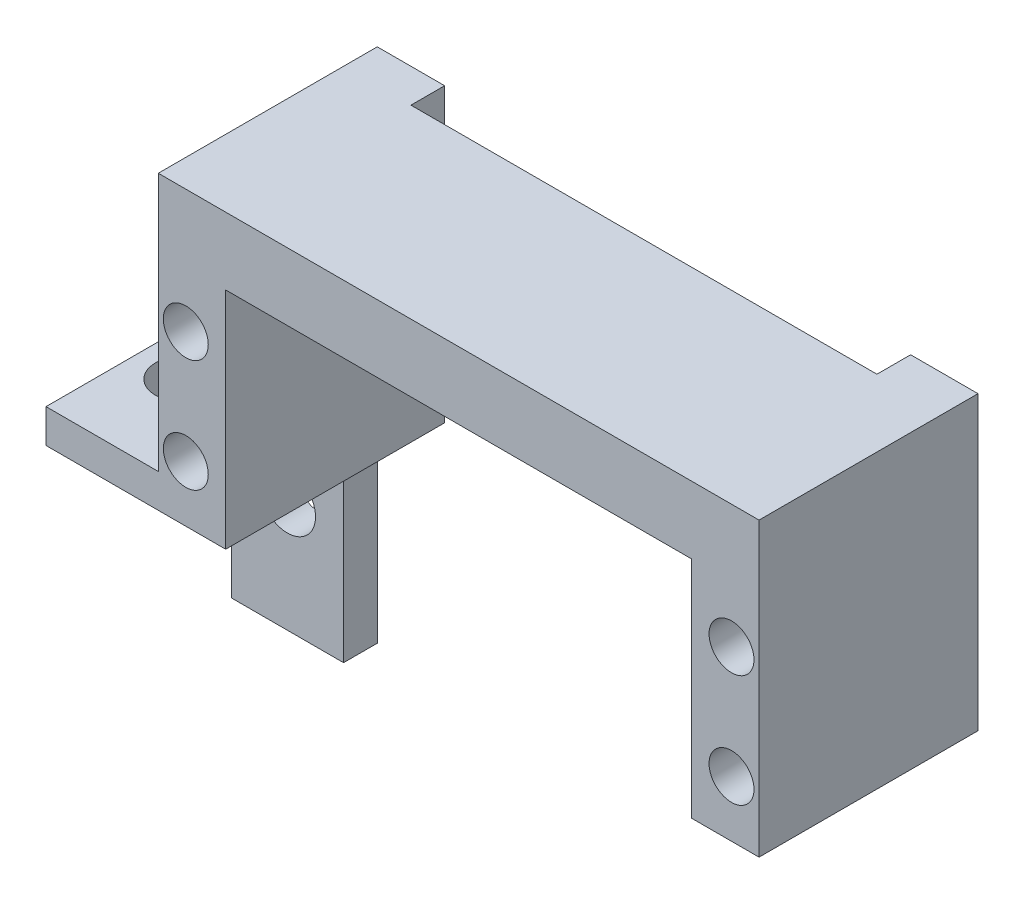
ISO-10303-21;
HEADER;
FILE_DESCRIPTION(('STEP AP214'),'2;1');
FILE_NAME('part.step','',(''),(''),'','','');
FILE_SCHEMA(('AUTOMOTIVE_DESIGN { 1 0 10303 214 1 1 1 1 }'));
ENDSEC;
DATA;
#1=APPLICATION_CONTEXT('core data for automotive mechanical design processes');
#2=APPLICATION_PROTOCOL_DEFINITION('international standard','automotive_design',2000,#1);
#3=PRODUCT_CONTEXT('',#1,'mechanical');
#4=PRODUCT('Part','Part','',(#3));
#5=PRODUCT_RELATED_PRODUCT_CATEGORY('part','',(#4));
#6=PRODUCT_DEFINITION_FORMATION('','',#4);
#7=PRODUCT_DEFINITION_CONTEXT('part definition',#1,'design');
#8=PRODUCT_DEFINITION('design','',#6,#7);
#9=PRODUCT_DEFINITION_SHAPE('','',#8);
#10=(LENGTH_UNIT() NAMED_UNIT(*) SI_UNIT(.MILLI.,.METRE.));
#11=(NAMED_UNIT(*) PLANE_ANGLE_UNIT() SI_UNIT($,.RADIAN.));
#12=(NAMED_UNIT(*) SI_UNIT($,.STERADIAN.) SOLID_ANGLE_UNIT());
#13=UNCERTAINTY_MEASURE_WITH_UNIT(LENGTH_MEASURE(1.E-05),#10,'distance_accuracy_value','');
#14=(GEOMETRIC_REPRESENTATION_CONTEXT(3) GLOBAL_UNCERTAINTY_ASSIGNED_CONTEXT((#13)) GLOBAL_UNIT_ASSIGNED_CONTEXT((#10,
#11,#12)) REPRESENTATION_CONTEXT('',''));
#15=CARTESIAN_POINT('',(0.,0.,0.));
#16=DIRECTION('',(0.,0.,1.));
#17=DIRECTION('',(1.,0.,0.));
#18=AXIS2_PLACEMENT_3D('',#15,#16,#17);
#19=CARTESIAN_POINT('',(20.75,-26.,16.5));
#20=DIRECTION('',(0.,1.,0.));
#21=DIRECTION('',(0.,0.,1.));
#22=AXIS2_PLACEMENT_3D('',#19,#20,#21);
#23=PLANE('',#22);
#24=DIRECTION('',(1.,0.,0.));
#25=VECTOR('',#24,1.);
#26=CARTESIAN_POINT('',(20.75,-26.,16.5));
#27=LINE('',#26,#25);
#28=CARTESIAN_POINT('',(36.75,-26.,16.5));
#29=VERTEX_POINT('',#28);
#30=CARTESIAN_POINT('',(52.75,-26.,16.5));
#31=VERTEX_POINT('',#30);
#32=EDGE_CURVE('E11',#29,#31,#27,.T.);
#33=ORIENTED_EDGE('',*,*,#32,.F.);
#34=DIRECTION('',(0.,0.,-1.));
#35=VECTOR('',#34,1.);
#36=CARTESIAN_POINT('',(36.75,-26.,16.5));
#37=LINE('',#36,#35);
#38=CARTESIAN_POINT('',(36.75,-26.,0.));
#39=VERTEX_POINT('',#38);
#40=EDGE_CURVE('E268',#29,#39,#37,.T.);
#41=ORIENTED_EDGE('',*,*,#40,.T.);
#42=DIRECTION('',(1.,0.,0.));
#43=VECTOR('',#42,1.);
#44=CARTESIAN_POINT('',(20.75,-26.,0.));
#45=LINE('',#44,#43);
#46=CARTESIAN_POINT('',(46.75,-26.,0.));
#47=VERTEX_POINT('',#46);
#48=EDGE_CURVE('E38',#39,#47,#45,.T.);
#49=ORIENTED_EDGE('',*,*,#48,.T.);
#50=DIRECTION('',(0.,0.,1.));
#51=VECTOR('',#50,1.);
#52=CARTESIAN_POINT('',(46.75,-26.,-3.));
#53=LINE('',#52,#51);
#54=CARTESIAN_POINT('',(46.75,-26.,-3.));
#55=VERTEX_POINT('',#54);
#56=EDGE_CURVE('E267',#55,#47,#53,.T.);
#57=ORIENTED_EDGE('',*,*,#56,.F.);
#58=DIRECTION('',(1.,0.,0.));
#59=VECTOR('',#58,1.);
#60=CARTESIAN_POINT('',(52.75,-26.,-3.));
#61=LINE('',#60,#59);
#62=CARTESIAN_POINT('',(52.75,-26.,-3.));
#63=VERTEX_POINT('',#62);
#64=EDGE_CURVE('E279',#55,#63,#61,.T.);
#65=ORIENTED_EDGE('',*,*,#64,.T.);
#66=DIRECTION('',(0.,0.,-1.));
#67=VECTOR('',#66,1.);
#68=CARTESIAN_POINT('',(52.75,-26.,16.5));
#69=LINE('',#68,#67);
#70=EDGE_CURVE('E228',#31,#63,#69,.T.);
#71=ORIENTED_EDGE('',*,*,#70,.F.);
#72=EDGE_LOOP('',(#33,#41,#49,#57,#65,#71));
#73=FACE_BOUND('',#72,.T.);
#74=CARTESIAN_POINT('',(40.75,-26.,8.25));
#75=DIRECTION('',(0.,-1.,0.));
#76=DIRECTION('',(0.,0.,1.));
#77=AXIS2_PLACEMENT_3D('',#74,#75,#76);
#78=CIRCLE('',#77,2.5);
#79=CARTESIAN_POINT('',(40.75,-26.,10.75));
#80=VERTEX_POINT('',#79);
#81=EDGE_CURVE('E205',#80,#80,#78,.T.);
#82=ORIENTED_EDGE('',*,*,#81,.F.);
#83=EDGE_LOOP('',(#82));
#84=FACE_BOUND('',#83,.T.);
#85=ADVANCED_FACE('F35',(#73,#84),#23,.F.);
#86=CARTESIAN_POINT('',(0.,0.,16.5));
#87=DIRECTION('',(0.,0.,1.));
#88=DIRECTION('',(1.,0.,0.));
#89=AXIS2_PLACEMENT_3D('',#86,#87,#88);
#90=PLANE('',#89);
#91=DIRECTION('',(0.,-1.,0.));
#92=VECTOR('',#91,1.);
#93=CARTESIAN_POINT('',(36.75,-46.,16.5));
#94=LINE('',#93,#92);
#95=CARTESIAN_POINT('',(36.75,-23.,16.5));
#96=VERTEX_POINT('',#95);
#97=EDGE_CURVE('E569',#96,#29,#94,.T.);
#98=ORIENTED_EDGE('',*,*,#97,.T.);
#99=ORIENTED_EDGE('',*,*,#32,.T.);
#100=DIRECTION('',(0.,-1.,0.));
#101=VECTOR('',#100,1.);
#102=CARTESIAN_POINT('',(52.75,-6.,16.5));
#103=LINE('',#102,#101);
#104=CARTESIAN_POINT('',(52.75,-6.,16.5));
#105=VERTEX_POINT('',#104);
#106=EDGE_CURVE('E225',#105,#31,#103,.T.);
#107=ORIENTED_EDGE('',*,*,#106,.F.);
#108=DIRECTION('',(-1.,0.,0.));
#109=VECTOR('',#108,1.);
#110=CARTESIAN_POINT('',(73.5,-6.,16.5));
#111=LINE('',#110,#109);
#112=CARTESIAN_POINT('',(94.25,-6.,16.5));
#113=VERTEX_POINT('',#112);
#114=EDGE_CURVE('E222',#113,#105,#111,.T.);
#115=ORIENTED_EDGE('',*,*,#114,.F.);
#116=DIRECTION('',(0.,1.,0.));
#117=VECTOR('',#116,1.);
#118=CARTESIAN_POINT('',(94.25,-6.,16.5));
#119=LINE('',#118,#117);
#120=CARTESIAN_POINT('',(94.25,-26.,16.5));
#121=VERTEX_POINT('',#120);
#122=EDGE_CURVE('E219',#121,#113,#119,.T.);
#123=ORIENTED_EDGE('',*,*,#122,.F.);
#124=DIRECTION('',(-1.,0.,0.));
#125=VECTOR('',#124,1.);
#126=CARTESIAN_POINT('',(94.25,-26.,16.5));
#127=LINE('',#126,#125);
#128=CARTESIAN_POINT('',(100.25,-26.,16.5));
#129=VERTEX_POINT('',#128);
#130=EDGE_CURVE('E217',#129,#121,#127,.T.);
#131=ORIENTED_EDGE('',*,*,#130,.F.);
#132=DIRECTION('',(0.,-1.,0.));
#133=VECTOR('',#132,1.);
#134=CARTESIAN_POINT('',(100.25,0.,16.5));
#135=LINE('',#134,#133);
#136=CARTESIAN_POINT('',(100.25,0.,16.5));
#137=VERTEX_POINT('',#136);
#138=EDGE_CURVE('E148',#137,#129,#135,.T.);
#139=ORIENTED_EDGE('',*,*,#138,.F.);
#140=DIRECTION('',(1.,0.,0.));
#141=VECTOR('',#140,1.);
#142=CARTESIAN_POINT('',(73.5,0.,16.5));
#143=LINE('',#142,#141);
#144=CARTESIAN_POINT('',(46.75,0.,16.5));
#145=VERTEX_POINT('',#144);
#146=EDGE_CURVE('E212',#145,#137,#143,.T.);
#147=ORIENTED_EDGE('',*,*,#146,.F.);
#148=DIRECTION('',(0.,1.,0.));
#149=VECTOR('',#148,1.);
#150=CARTESIAN_POINT('',(46.75,0.,16.5));
#151=LINE('',#150,#149);
#152=CARTESIAN_POINT('',(46.75,-23.,16.5));
#153=VERTEX_POINT('',#152);
#154=EDGE_CURVE('E209',#153,#145,#151,.T.);
#155=ORIENTED_EDGE('',*,*,#154,.F.);
#156=DIRECTION('',(1.,0.,0.));
#157=VECTOR('',#156,1.);
#158=CARTESIAN_POINT('',(36.75,-23.,16.5));
#159=LINE('',#158,#157);
#160=EDGE_CURVE('E253',#96,#153,#159,.T.);
#161=ORIENTED_EDGE('',*,*,#160,.F.);
#162=EDGE_LOOP('',(#98,#99,#107,#115,#123,#131,#139,#147,#155,#161));
#163=FACE_BOUND('',#162,.T.);
#164=CARTESIAN_POINT('',(49.2,-21.,16.5));
#165=DIRECTION('',(0.,0.,1.));
#166=DIRECTION('',(1.,0.,0.));
#167=AXIS2_PLACEMENT_3D('',#164,#165,#166);
#168=CIRCLE('',#167,2.);
#169=CARTESIAN_POINT('',(51.2,-21.,16.5));
#170=VERTEX_POINT('',#169);
#171=EDGE_CURVE('E192',#170,#170,#168,.T.);
#172=ORIENTED_EDGE('',*,*,#171,.F.);
#173=EDGE_LOOP('',(#172));
#174=FACE_BOUND('',#173,.T.);
#175=CARTESIAN_POINT('',(97.8,-21.,16.5));
#176=DIRECTION('',(0.,0.,1.));
#177=DIRECTION('',(-1.,0.,0.));
#178=AXIS2_PLACEMENT_3D('',#175,#176,#177);
#179=CIRCLE('',#178,2.);
#180=CARTESIAN_POINT('',(95.8,-21.,16.5));
#181=VERTEX_POINT('',#180);
#182=EDGE_CURVE('E195',#181,#181,#179,.T.);
#183=ORIENTED_EDGE('',*,*,#182,.F.);
#184=EDGE_LOOP('',(#183));
#185=FACE_BOUND('',#184,.T.);
#186=CARTESIAN_POINT('',(97.8,-11.,16.5));
#187=DIRECTION('',(0.,0.,1.));
#188=DIRECTION('',(-1.,0.,0.));
#189=AXIS2_PLACEMENT_3D('',#186,#187,#188);
#190=CIRCLE('',#189,2.);
#191=CARTESIAN_POINT('',(95.8,-11.,16.5));
#192=VERTEX_POINT('',#191);
#193=EDGE_CURVE('E191',#192,#192,#190,.T.);
#194=ORIENTED_EDGE('',*,*,#193,.F.);
#195=EDGE_LOOP('',(#194));
#196=FACE_BOUND('',#195,.T.);
#197=CARTESIAN_POINT('',(49.2,-11.,16.5));
#198=DIRECTION('',(0.,0.,1.));
#199=DIRECTION('',(1.,0.,0.));
#200=AXIS2_PLACEMENT_3D('',#197,#198,#199);
#201=CIRCLE('',#200,2.);
#202=CARTESIAN_POINT('',(51.2,-11.,16.5));
#203=VERTEX_POINT('',#202);
#204=EDGE_CURVE('E150',#203,#203,#201,.T.);
#205=ORIENTED_EDGE('',*,*,#204,.F.);
#206=EDGE_LOOP('',(#205));
#207=FACE_BOUND('',#206,.T.);
#208=ADVANCED_FACE('F310',(#163,#174,#185,#196,#207),#90,.T.);
#209=CARTESIAN_POINT('',(0.,-23.,0.));
#210=DIRECTION('',(0.,-1.,0.));
#211=DIRECTION('',(0.,0.,-1.));
#212=AXIS2_PLACEMENT_3D('',#209,#210,#211);
#213=PLANE('',#212);
#214=DIRECTION('',(1.,0.,0.));
#215=VECTOR('',#214,1.);
#216=CARTESIAN_POINT('',(26.75,-23.,-3.));
#217=LINE('',#216,#215);
#218=CARTESIAN_POINT('',(36.75,-23.,-3.));
#219=VERTEX_POINT('',#218);
#220=CARTESIAN_POINT('',(46.75,-23.,-3.));
#221=VERTEX_POINT('',#220);
#222=EDGE_CURVE('E248',#219,#221,#217,.T.);
#223=ORIENTED_EDGE('',*,*,#222,.F.);
#224=DIRECTION('',(0.,0.,1.));
#225=VECTOR('',#224,1.);
#226=CARTESIAN_POINT('',(36.75,-23.,0.));
#227=LINE('',#226,#225);
#228=EDGE_CURVE('E57',#219,#96,#227,.T.);
#229=ORIENTED_EDGE('',*,*,#228,.T.);
#230=ORIENTED_EDGE('',*,*,#160,.T.);
#231=DIRECTION('',(0.,0.,1.));
#232=VECTOR('',#231,1.);
#233=CARTESIAN_POINT('',(46.75,-23.,0.));
#234=LINE('',#233,#232);
#235=EDGE_CURVE('E149',#221,#153,#234,.T.);
#236=ORIENTED_EDGE('',*,*,#235,.F.);
#237=EDGE_LOOP('',(#223,#229,#230,#236));
#238=FACE_BOUND('',#237,.T.);
#239=CARTESIAN_POINT('',(40.75,-23.,8.25));
#240=DIRECTION('',(0.,1.,0.));
#241=DIRECTION('',(0.,0.,-1.));
#242=AXIS2_PLACEMENT_3D('',#239,#240,#241);
#243=CIRCLE('',#242,2.5);
#244=CARTESIAN_POINT('',(40.75,-23.,5.75));
#245=VERTEX_POINT('',#244);
#246=EDGE_CURVE('E204',#245,#245,#243,.F.);
#247=ORIENTED_EDGE('',*,*,#246,.T.);
#248=EDGE_LOOP('',(#247));
#249=FACE_BOUND('',#248,.T.);
#250=ADVANCED_FACE('F316',(#238,#249),#213,.F.);
#251=CARTESIAN_POINT('',(0.,0.,0.));
#252=DIRECTION('',(0.,0.,1.));
#253=DIRECTION('',(1.,0.,0.));
#254=AXIS2_PLACEMENT_3D('',#251,#252,#253);
#255=PLANE('',#254);
#256=DIRECTION('',(0.,1.,0.));
#257=VECTOR('',#256,1.);
#258=CARTESIAN_POINT('',(36.75,0.,0.));
#259=LINE('',#258,#257);
#260=CARTESIAN_POINT('',(36.75,-46.,0.));
#261=VERTEX_POINT('',#260);
#262=EDGE_CURVE('E571',#261,#39,#259,.T.);
#263=ORIENTED_EDGE('',*,*,#262,.F.);
#264=DIRECTION('',(-1.,0.,0.));
#265=VECTOR('',#264,1.);
#266=CARTESIAN_POINT('',(26.75,-46.,0.));
#267=LINE('',#266,#265);
#268=CARTESIAN_POINT('',(46.75,-46.,0.));
#269=VERTEX_POINT('',#268);
#270=EDGE_CURVE('E245',#269,#261,#267,.T.);
#271=ORIENTED_EDGE('',*,*,#270,.F.);
#272=DIRECTION('',(0.,1.,0.));
#273=VECTOR('',#272,1.);
#274=CARTESIAN_POINT('',(46.75,-23.,0.));
#275=LINE('',#274,#273);
#276=EDGE_CURVE('E180',#269,#47,#275,.T.);
#277=ORIENTED_EDGE('',*,*,#276,.T.);
#278=ORIENTED_EDGE('',*,*,#48,.F.);
#279=EDGE_LOOP('',(#263,#271,#277,#278));
#280=FACE_BOUND('',#279,.T.);
#281=CARTESIAN_POINT('',(41.75,-36.,0.));
#282=DIRECTION('',(0.,0.,1.));
#283=DIRECTION('',(1.,0.,0.));
#284=AXIS2_PLACEMENT_3D('',#281,#282,#283);
#285=CIRCLE('',#284,2.5);
#286=CARTESIAN_POINT('',(44.25,-36.,0.));
#287=VERTEX_POINT('',#286);
#288=EDGE_CURVE('E177',#287,#287,#285,.T.);
#289=ORIENTED_EDGE('',*,*,#288,.F.);
#290=EDGE_LOOP('',(#289));
#291=FACE_BOUND('',#290,.T.);
#292=ADVANCED_FACE('F272',(#280,#291),#255,.T.);
#293=CARTESIAN_POINT('',(26.75,-46.,-3.));
#294=DIRECTION('',(0.,1.,0.));
#295=DIRECTION('',(-1.,0.,0.));
#296=AXIS2_PLACEMENT_3D('',#293,#294,#295);
#297=PLANE('',#296);
#298=ORIENTED_EDGE('',*,*,#270,.T.);
#299=DIRECTION('',(0.,0.,-1.));
#300=VECTOR('',#299,1.);
#301=CARTESIAN_POINT('',(36.75,-46.,16.5));
#302=LINE('',#301,#300);
#303=CARTESIAN_POINT('',(36.75,-46.,-3.));
#304=VERTEX_POINT('',#303);
#305=EDGE_CURVE('E567',#261,#304,#302,.T.);
#306=ORIENTED_EDGE('',*,*,#305,.T.);
#307=DIRECTION('',(-1.,0.,0.));
#308=VECTOR('',#307,1.);
#309=CARTESIAN_POINT('',(26.75,-46.,-3.));
#310=LINE('',#309,#308);
#311=CARTESIAN_POINT('',(46.75,-46.,-3.));
#312=VERTEX_POINT('',#311);
#313=EDGE_CURVE('E250',#312,#304,#310,.T.);
#314=ORIENTED_EDGE('',*,*,#313,.F.);
#315=DIRECTION('',(0.,0.,1.));
#316=VECTOR('',#315,1.);
#317=CARTESIAN_POINT('',(46.75,-46.,-3.));
#318=LINE('',#317,#316);
#319=EDGE_CURVE('E186',#312,#269,#318,.T.);
#320=ORIENTED_EDGE('',*,*,#319,.T.);
#321=EDGE_LOOP('',(#298,#306,#314,#320));
#322=FACE_BOUND('',#321,.T.);
#323=ADVANCED_FACE('F325',(#322),#297,.F.);
#324=CARTESIAN_POINT('',(0.,0.,-3.));
#325=DIRECTION('',(0.,0.,1.));
#326=DIRECTION('',(1.,0.,0.));
#327=AXIS2_PLACEMENT_3D('',#324,#325,#326);
#328=PLANE('',#327);
#329=ORIENTED_EDGE('',*,*,#313,.T.);
#330=DIRECTION('',(0.,-1.,0.));
#331=VECTOR('',#330,1.);
#332=CARTESIAN_POINT('',(36.75,-46.,-3.));
#333=LINE('',#332,#331);
#334=EDGE_CURVE('E156',#219,#304,#333,.T.);
#335=ORIENTED_EDGE('',*,*,#334,.F.);
#336=ORIENTED_EDGE('',*,*,#222,.T.);
#337=DIRECTION('',(0.,-1.,0.));
#338=VECTOR('',#337,1.);
#339=CARTESIAN_POINT('',(46.75,-26.,-3.));
#340=LINE('',#339,#338);
#341=CARTESIAN_POINT('',(46.75,0.,-3.));
#342=VERTEX_POINT('',#341);
#343=EDGE_CURVE('E283',#342,#221,#340,.T.);
#344=ORIENTED_EDGE('',*,*,#343,.F.);
#345=DIRECTION('',(-1.,0.,0.));
#346=VECTOR('',#345,1.);
#347=CARTESIAN_POINT('',(52.75,0.,-3.));
#348=LINE('',#347,#346);
#349=CARTESIAN_POINT('',(52.75,0.,-3.));
#350=VERTEX_POINT('',#349);
#351=EDGE_CURVE('E593',#350,#342,#348,.T.);
#352=ORIENTED_EDGE('',*,*,#351,.F.);
#353=DIRECTION('',(0.,1.,0.));
#354=VECTOR('',#353,1.);
#355=CARTESIAN_POINT('',(52.75,-26.,-3.));
#356=LINE('',#355,#354);
#357=EDGE_CURVE('E576',#63,#350,#356,.T.);
#358=ORIENTED_EDGE('',*,*,#357,.F.);
#359=ORIENTED_EDGE('',*,*,#64,.F.);
#360=DIRECTION('',(0.,1.,0.));
#361=VECTOR('',#360,1.);
#362=CARTESIAN_POINT('',(46.75,-23.,-3.));
#363=LINE('',#362,#361);
#364=EDGE_CURVE('E183',#312,#55,#363,.T.);
#365=ORIENTED_EDGE('',*,*,#364,.F.);
#366=EDGE_LOOP('',(#329,#335,#336,#344,#352,#358,#359,#365));
#367=FACE_BOUND('',#366,.T.);
#368=CARTESIAN_POINT('',(41.75,-36.,-3.));
#369=DIRECTION('',(0.,0.,1.));
#370=DIRECTION('',(1.,0.,0.));
#371=AXIS2_PLACEMENT_3D('',#368,#369,#370);
#372=CIRCLE('',#371,2.5);
#373=CARTESIAN_POINT('',(44.25,-36.,-3.));
#374=VERTEX_POINT('',#373);
#375=EDGE_CURVE('E176',#374,#374,#372,.T.);
#376=ORIENTED_EDGE('',*,*,#375,.T.);
#377=EDGE_LOOP('',(#376));
#378=FACE_BOUND('',#377,.T.);
#379=CARTESIAN_POINT('',(49.2,-11.,-3.));
#380=DIRECTION('',(0.,0.,1.));
#381=DIRECTION('',(1.,0.,0.));
#382=AXIS2_PLACEMENT_3D('',#379,#380,#381);
#383=CIRCLE('',#382,2.);
#384=CARTESIAN_POINT('',(51.2,-11.,-3.));
#385=VERTEX_POINT('',#384);
#386=EDGE_CURVE('E589',#385,#385,#383,.T.);
#387=ORIENTED_EDGE('',*,*,#386,.T.);
#388=EDGE_LOOP('',(#387));
#389=FACE_BOUND('',#388,.T.);
#390=CARTESIAN_POINT('',(49.2,-21.,-3.));
#391=DIRECTION('',(0.,0.,1.));
#392=DIRECTION('',(1.,0.,0.));
#393=AXIS2_PLACEMENT_3D('',#390,#391,#392);
#394=CIRCLE('',#393,2.);
#395=CARTESIAN_POINT('',(51.2,-21.,-3.));
#396=VERTEX_POINT('',#395);
#397=EDGE_CURVE('E586',#396,#396,#394,.T.);
#398=ORIENTED_EDGE('',*,*,#397,.T.);
#399=EDGE_LOOP('',(#398));
#400=FACE_BOUND('',#399,.T.);
#401=ADVANCED_FACE('F328',(#367,#378,#389,#400),#328,.F.);
#402=CARTESIAN_POINT('',(73.5,0.,0.));
#403=DIRECTION('',(0.,0.,1.));
#404=DIRECTION('',(-1.,0.,0.));
#405=AXIS2_PLACEMENT_3D('',#402,#403,#404);
#406=PLANE('',#405);
#407=DIRECTION('',(0.,1.,0.));
#408=VECTOR('',#407,1.);
#409=CARTESIAN_POINT('',(52.75,-26.,0.));
#410=LINE('',#409,#408);
#411=CARTESIAN_POINT('',(52.75,-6.,0.));
#412=VERTEX_POINT('',#411);
#413=CARTESIAN_POINT('',(52.75,0.,0.));
#414=VERTEX_POINT('',#413);
#415=EDGE_CURVE('E286',#412,#414,#410,.T.);
#416=ORIENTED_EDGE('',*,*,#415,.T.);
#417=DIRECTION('',(1.,0.,0.));
#418=VECTOR('',#417,1.);
#419=CARTESIAN_POINT('',(73.5,0.,0.));
#420=LINE('',#419,#418);
#421=CARTESIAN_POINT('',(94.25,0.,0.));
#422=VERTEX_POINT('',#421);
#423=EDGE_CURVE('E208',#414,#422,#420,.T.);
#424=ORIENTED_EDGE('',*,*,#423,.T.);
#425=DIRECTION('',(0.,-1.,0.));
#426=VECTOR('',#425,1.);
#427=CARTESIAN_POINT('',(94.25,0.,0.));
#428=LINE('',#427,#426);
#429=CARTESIAN_POINT('',(94.25,-6.,0.));
#430=VERTEX_POINT('',#429);
#431=EDGE_CURVE('E163',#422,#430,#428,.T.);
#432=ORIENTED_EDGE('',*,*,#431,.T.);
#433=DIRECTION('',(-1.,0.,0.));
#434=VECTOR('',#433,1.);
#435=CARTESIAN_POINT('',(73.5,-6.,0.));
#436=LINE('',#435,#434);
#437=EDGE_CURVE('E213',#430,#412,#436,.T.);
#438=ORIENTED_EDGE('',*,*,#437,.T.);
#439=EDGE_LOOP('',(#416,#424,#432,#438));
#440=FACE_BOUND('',#439,.T.);
#441=ADVANCED_FACE('F333',(#440),#406,.F.);
#442=CARTESIAN_POINT('',(46.75,-23.,-3.));
#443=DIRECTION('',(-1.,0.,0.));
#444=DIRECTION('',(0.,1.,0.));
#445=AXIS2_PLACEMENT_3D('',#442,#443,#444);
#446=PLANE('',#445);
#447=ORIENTED_EDGE('',*,*,#56,.T.);
#448=ORIENTED_EDGE('',*,*,#276,.F.);
#449=ORIENTED_EDGE('',*,*,#319,.F.);
#450=ORIENTED_EDGE('',*,*,#364,.T.);
#451=EDGE_LOOP('',(#447,#448,#449,#450));
#452=FACE_BOUND('',#451,.T.);
#453=ADVANCED_FACE('F276',(#452),#446,.F.);
#454=CARTESIAN_POINT('',(46.75,0.,16.5));
#455=DIRECTION('',(1.,0.,0.));
#456=DIRECTION('',(0.,-1.,0.));
#457=AXIS2_PLACEMENT_3D('',#454,#455,#456);
#458=PLANE('',#457);
#459=ORIENTED_EDGE('',*,*,#235,.T.);
#460=ORIENTED_EDGE('',*,*,#154,.T.);
#461=DIRECTION('',(0.,0.,-1.));
#462=VECTOR('',#461,1.);
#463=CARTESIAN_POINT('',(46.75,0.,16.5));
#464=LINE('',#463,#462);
#465=EDGE_CURVE('E242',#145,#342,#464,.T.);
#466=ORIENTED_EDGE('',*,*,#465,.T.);
#467=ORIENTED_EDGE('',*,*,#343,.T.);
#468=EDGE_LOOP('',(#459,#460,#466,#467));
#469=FACE_BOUND('',#468,.T.);
#470=ADVANCED_FACE('F335',(#469),#458,.F.);
#471=CARTESIAN_POINT('',(73.5,0.,16.5));
#472=DIRECTION('',(0.,-1.,0.));
#473=DIRECTION('',(0.,0.,-1.));
#474=AXIS2_PLACEMENT_3D('',#471,#472,#473);
#475=PLANE('',#474);
#476=ORIENTED_EDGE('',*,*,#465,.F.);
#477=ORIENTED_EDGE('',*,*,#146,.T.);
#478=DIRECTION('',(0.,0.,-1.));
#479=VECTOR('',#478,1.);
#480=CARTESIAN_POINT('',(100.25,0.,16.5));
#481=LINE('',#480,#479);
#482=CARTESIAN_POINT('',(100.25,0.,-3.));
#483=VERTEX_POINT('',#482);
#484=EDGE_CURVE('E240',#137,#483,#481,.T.);
#485=ORIENTED_EDGE('',*,*,#484,.T.);
#486=DIRECTION('',(-1.,0.,0.));
#487=VECTOR('',#486,1.);
#488=CARTESIAN_POINT('',(100.25,0.,-3.));
#489=LINE('',#488,#487);
#490=CARTESIAN_POINT('',(94.25,0.,-3.));
#491=VERTEX_POINT('',#490);
#492=EDGE_CURVE('E161',#483,#491,#489,.T.);
#493=ORIENTED_EDGE('',*,*,#492,.T.);
#494=DIRECTION('',(0.,0.,1.));
#495=VECTOR('',#494,1.);
#496=CARTESIAN_POINT('',(94.25,0.,-3.));
#497=LINE('',#496,#495);
#498=EDGE_CURVE('E173',#491,#422,#497,.T.);
#499=ORIENTED_EDGE('',*,*,#498,.T.);
#500=ORIENTED_EDGE('',*,*,#423,.F.);
#501=DIRECTION('',(0.,0.,1.));
#502=VECTOR('',#501,1.);
#503=CARTESIAN_POINT('',(52.75,0.,-3.));
#504=LINE('',#503,#502);
#505=EDGE_CURVE('E278',#350,#414,#504,.T.);
#506=ORIENTED_EDGE('',*,*,#505,.F.);
#507=ORIENTED_EDGE('',*,*,#351,.T.);
#508=EDGE_LOOP('',(#476,#477,#485,#493,#499,#500,#506,#507));
#509=FACE_BOUND('',#508,.T.);
#510=ADVANCED_FACE('F338',(#509),#475,.F.);
#511=CARTESIAN_POINT('',(100.25,0.,16.5));
#512=DIRECTION('',(-1.,0.,0.));
#513=DIRECTION('',(0.,1.,0.));
#514=AXIS2_PLACEMENT_3D('',#511,#512,#513);
#515=PLANE('',#514);
#516=ORIENTED_EDGE('',*,*,#484,.F.);
#517=ORIENTED_EDGE('',*,*,#138,.T.);
#518=DIRECTION('',(0.,0.,-1.));
#519=VECTOR('',#518,1.);
#520=CARTESIAN_POINT('',(100.25,-26.,16.5));
#521=LINE('',#520,#519);
#522=CARTESIAN_POINT('',(100.25,-26.,-3.));
#523=VERTEX_POINT('',#522);
#524=EDGE_CURVE('E142',#129,#523,#521,.T.);
#525=ORIENTED_EDGE('',*,*,#524,.T.);
#526=DIRECTION('',(0.,1.,0.));
#527=VECTOR('',#526,1.);
#528=CARTESIAN_POINT('',(100.25,0.,-3.));
#529=LINE('',#528,#527);
#530=EDGE_CURVE('E146',#523,#483,#529,.T.);
#531=ORIENTED_EDGE('',*,*,#530,.T.);
#532=EDGE_LOOP('',(#516,#517,#525,#531));
#533=FACE_BOUND('',#532,.T.);
#534=ADVANCED_FACE('F144',(#533),#515,.F.);
#535=CARTESIAN_POINT('',(94.25,-26.,16.5));
#536=DIRECTION('',(0.,1.,0.));
#537=DIRECTION('',(0.,0.,1.));
#538=AXIS2_PLACEMENT_3D('',#535,#536,#537);
#539=PLANE('',#538);
#540=DIRECTION('',(0.,0.,-1.));
#541=VECTOR('',#540,1.);
#542=CARTESIAN_POINT('',(94.25,-26.,16.5));
#543=LINE('',#542,#541);
#544=CARTESIAN_POINT('',(94.25,-26.,-3.));
#545=VERTEX_POINT('',#544);
#546=EDGE_CURVE('E49',#121,#545,#543,.T.);
#547=ORIENTED_EDGE('',*,*,#546,.T.);
#548=DIRECTION('',(1.,0.,0.));
#549=VECTOR('',#548,1.);
#550=CARTESIAN_POINT('',(94.25,-26.,-3.));
#551=LINE('',#550,#549);
#552=EDGE_CURVE('E152',#545,#523,#551,.T.);
#553=ORIENTED_EDGE('',*,*,#552,.T.);
#554=ORIENTED_EDGE('',*,*,#524,.F.);
#555=ORIENTED_EDGE('',*,*,#130,.T.);
#556=EDGE_LOOP('',(#547,#553,#554,#555));
#557=FACE_BOUND('',#556,.T.);
#558=ADVANCED_FACE('F153',(#557),#539,.F.);
#559=CARTESIAN_POINT('',(94.25,-6.,16.5));
#560=DIRECTION('',(1.,0.,0.));
#561=DIRECTION('',(0.,-1.,0.));
#562=AXIS2_PLACEMENT_3D('',#559,#560,#561);
#563=PLANE('',#562);
#564=DIRECTION('',(0.,-1.,0.));
#565=VECTOR('',#564,1.);
#566=CARTESIAN_POINT('',(94.25,0.,-3.));
#567=LINE('',#566,#565);
#568=EDGE_CURVE('E165',#491,#545,#567,.T.);
#569=ORIENTED_EDGE('',*,*,#568,.T.);
#570=ORIENTED_EDGE('',*,*,#546,.F.);
#571=ORIENTED_EDGE('',*,*,#122,.T.);
#572=DIRECTION('',(0.,0.,-1.));
#573=VECTOR('',#572,1.);
#574=CARTESIAN_POINT('',(94.25,-6.,16.5));
#575=LINE('',#574,#573);
#576=EDGE_CURVE('E237',#113,#430,#575,.T.);
#577=ORIENTED_EDGE('',*,*,#576,.T.);
#578=ORIENTED_EDGE('',*,*,#431,.F.);
#579=ORIENTED_EDGE('',*,*,#498,.F.);
#580=EDGE_LOOP('',(#569,#570,#571,#577,#578,#579));
#581=FACE_BOUND('',#580,.T.);
#582=ADVANCED_FACE('F347',(#581),#563,.F.);
#583=CARTESIAN_POINT('',(73.5,-6.,16.5));
#584=DIRECTION('',(0.,1.,0.));
#585=DIRECTION('',(0.,0.,1.));
#586=AXIS2_PLACEMENT_3D('',#583,#584,#585);
#587=PLANE('',#586);
#588=ORIENTED_EDGE('',*,*,#437,.F.);
#589=ORIENTED_EDGE('',*,*,#576,.F.);
#590=ORIENTED_EDGE('',*,*,#114,.T.);
#591=DIRECTION('',(0.,0.,-1.));
#592=VECTOR('',#591,1.);
#593=CARTESIAN_POINT('',(52.75,-6.,16.5));
#594=LINE('',#593,#592);
#595=EDGE_CURVE('E235',#105,#412,#594,.T.);
#596=ORIENTED_EDGE('',*,*,#595,.T.);
#597=EDGE_LOOP('',(#588,#589,#590,#596));
#598=FACE_BOUND('',#597,.T.);
#599=ADVANCED_FACE('F350',(#598),#587,.F.);
#600=CARTESIAN_POINT('',(52.75,-6.,16.5));
#601=DIRECTION('',(-1.,0.,0.));
#602=DIRECTION('',(0.,1.,0.));
#603=AXIS2_PLACEMENT_3D('',#600,#601,#602);
#604=PLANE('',#603);
#605=ORIENTED_EDGE('',*,*,#595,.F.);
#606=ORIENTED_EDGE('',*,*,#106,.T.);
#607=ORIENTED_EDGE('',*,*,#70,.T.);
#608=ORIENTED_EDGE('',*,*,#357,.T.);
#609=ORIENTED_EDGE('',*,*,#505,.T.);
#610=ORIENTED_EDGE('',*,*,#415,.F.);
#611=EDGE_LOOP('',(#605,#606,#607,#608,#609,#610));
#612=FACE_BOUND('',#611,.T.);
#613=ADVANCED_FACE('F354',(#612),#604,.F.);
#614=CARTESIAN_POINT('',(40.75,-36.5,8.25));
#615=DIRECTION('',(0.,1.,0.));
#616=DIRECTION('',(0.,0.,1.));
#617=AXIS2_PLACEMENT_3D('',#614,#615,#616);
#618=CYLINDRICAL_SURFACE('',#617,2.5);
#619=ORIENTED_EDGE('',*,*,#246,.F.);
#620=EDGE_LOOP('',(#619));
#621=FACE_BOUND('',#620,.T.);
#622=ORIENTED_EDGE('',*,*,#81,.T.);
#623=EDGE_LOOP('',(#622));
#624=FACE_BOUND('',#623,.T.);
#625=ADVANCED_FACE('F306',(#621,#624),#618,.F.);
#626=CARTESIAN_POINT('',(49.2,-11.,16.5));
#627=DIRECTION('',(0.,0.,-1.));
#628=DIRECTION('',(1.,0.,0.));
#629=AXIS2_PLACEMENT_3D('',#626,#627,#628);
#630=CYLINDRICAL_SURFACE('',#629,2.);
#631=ORIENTED_EDGE('',*,*,#204,.T.);
#632=EDGE_LOOP('',(#631));
#633=FACE_BOUND('',#632,.T.);
#634=ORIENTED_EDGE('',*,*,#386,.F.);
#635=EDGE_LOOP('',(#634));
#636=FACE_BOUND('',#635,.T.);
#637=ADVANCED_FACE('F296',(#633,#636),#630,.F.);
#638=CARTESIAN_POINT('',(97.8,-11.,16.5));
#639=DIRECTION('',(0.,0.,-1.));
#640=DIRECTION('',(1.,0.,0.));
#641=AXIS2_PLACEMENT_3D('',#638,#639,#640);
#642=CYLINDRICAL_SURFACE('',#641,2.);
#643=ORIENTED_EDGE('',*,*,#193,.T.);
#644=EDGE_LOOP('',(#643));
#645=FACE_BOUND('',#644,.T.);
#646=CARTESIAN_POINT('',(97.8,-11.,-3.));
#647=DIRECTION('',(0.,0.,1.));
#648=DIRECTION('',(1.,0.,0.));
#649=AXIS2_PLACEMENT_3D('',#646,#647,#648);
#650=CIRCLE('',#649,2.);
#651=CARTESIAN_POINT('',(99.8,-11.,-3.));
#652=VERTEX_POINT('',#651);
#653=EDGE_CURVE('E168',#652,#652,#650,.T.);
#654=ORIENTED_EDGE('',*,*,#653,.F.);
#655=EDGE_LOOP('',(#654));
#656=FACE_BOUND('',#655,.T.);
#657=ADVANCED_FACE('F293',(#645,#656),#642,.F.);
#658=CARTESIAN_POINT('',(97.8,-21.,16.5));
#659=DIRECTION('',(0.,0.,-1.));
#660=DIRECTION('',(1.,0.,0.));
#661=AXIS2_PLACEMENT_3D('',#658,#659,#660);
#662=CYLINDRICAL_SURFACE('',#661,2.);
#663=ORIENTED_EDGE('',*,*,#182,.T.);
#664=EDGE_LOOP('',(#663));
#665=FACE_BOUND('',#664,.T.);
#666=CARTESIAN_POINT('',(97.8,-21.,-3.));
#667=DIRECTION('',(0.,0.,1.));
#668=DIRECTION('',(1.,0.,0.));
#669=AXIS2_PLACEMENT_3D('',#666,#667,#668);
#670=CIRCLE('',#669,2.);
#671=CARTESIAN_POINT('',(99.8,-21.,-3.));
#672=VERTEX_POINT('',#671);
#673=EDGE_CURVE('E281',#672,#672,#670,.T.);
#674=ORIENTED_EDGE('',*,*,#673,.F.);
#675=EDGE_LOOP('',(#674));
#676=FACE_BOUND('',#675,.T.);
#677=ADVANCED_FACE('F295',(#665,#676),#662,.F.);
#678=CARTESIAN_POINT('',(49.2,-21.,16.5));
#679=DIRECTION('',(0.,0.,-1.));
#680=DIRECTION('',(1.,0.,0.));
#681=AXIS2_PLACEMENT_3D('',#678,#679,#680);
#682=CYLINDRICAL_SURFACE('',#681,2.);
#683=ORIENTED_EDGE('',*,*,#171,.T.);
#684=EDGE_LOOP('',(#683));
#685=FACE_BOUND('',#684,.T.);
#686=ORIENTED_EDGE('',*,*,#397,.F.);
#687=EDGE_LOOP('',(#686));
#688=FACE_BOUND('',#687,.T.);
#689=ADVANCED_FACE('F303',(#685,#688),#682,.F.);
#690=CARTESIAN_POINT('',(41.75,-36.,0.));
#691=DIRECTION('',(0.,0.,-1.));
#692=DIRECTION('',(1.,0.,0.));
#693=AXIS2_PLACEMENT_3D('',#690,#691,#692);
#694=CYLINDRICAL_SURFACE('',#693,2.5);
#695=ORIENTED_EDGE('',*,*,#288,.T.);
#696=EDGE_LOOP('',(#695));
#697=FACE_BOUND('',#696,.T.);
#698=ORIENTED_EDGE('',*,*,#375,.F.);
#699=EDGE_LOOP('',(#698));
#700=FACE_BOUND('',#699,.T.);
#701=ADVANCED_FACE('F401',(#697,#700),#694,.F.);
#702=CARTESIAN_POINT('',(73.5,0.,-3.));
#703=DIRECTION('',(0.,0.,-1.));
#704=DIRECTION('',(1.,0.,0.));
#705=AXIS2_PLACEMENT_3D('',#702,#703,#704);
#706=PLANE('',#705);
#707=ORIENTED_EDGE('',*,*,#552,.F.);
#708=ORIENTED_EDGE('',*,*,#568,.F.);
#709=ORIENTED_EDGE('',*,*,#492,.F.);
#710=ORIENTED_EDGE('',*,*,#530,.F.);
#711=EDGE_LOOP('',(#707,#708,#709,#710));
#712=FACE_BOUND('',#711,.T.);
#713=ORIENTED_EDGE('',*,*,#653,.T.);
#714=EDGE_LOOP('',(#713));
#715=FACE_BOUND('',#714,.T.);
#716=ORIENTED_EDGE('',*,*,#673,.T.);
#717=EDGE_LOOP('',(#716));
#718=FACE_BOUND('',#717,.T.);
#719=ADVANCED_FACE('F158',(#712,#715,#718),#706,.T.);
#720=CARTESIAN_POINT('',(36.75,-46.,16.5));
#721=DIRECTION('',(1.,0.,0.));
#722=DIRECTION('',(0.,0.,-1.));
#723=AXIS2_PLACEMENT_3D('',#720,#721,#722);
#724=PLANE('',#723);
#725=ORIENTED_EDGE('',*,*,#334,.T.);
#726=ORIENTED_EDGE('',*,*,#305,.F.);
#727=ORIENTED_EDGE('',*,*,#262,.T.);
#728=ORIENTED_EDGE('',*,*,#40,.F.);
#729=ORIENTED_EDGE('',*,*,#97,.F.);
#730=ORIENTED_EDGE('',*,*,#228,.F.);
#731=EDGE_LOOP('',(#725,#726,#727,#728,#729,#730));
#732=FACE_BOUND('',#731,.T.);
#733=ADVANCED_FACE('F555',(#732),#724,.F.);
#734=CLOSED_SHELL('',(#85,#208,#250,#292,#323,#401,#441,#453,#470,#510,#534,#558,#582,#599,#613,
#625,#637,#657,#677,#689,#701,#719,#733));
#735=MANIFOLD_SOLID_BREP('B2',#734);
#736=ADVANCED_BREP_SHAPE_REPRESENTATION('',(#18,#735),#14);
#737=SHAPE_DEFINITION_REPRESENTATION(#9,#736);
ENDSEC;
END-ISO-10303-21;
